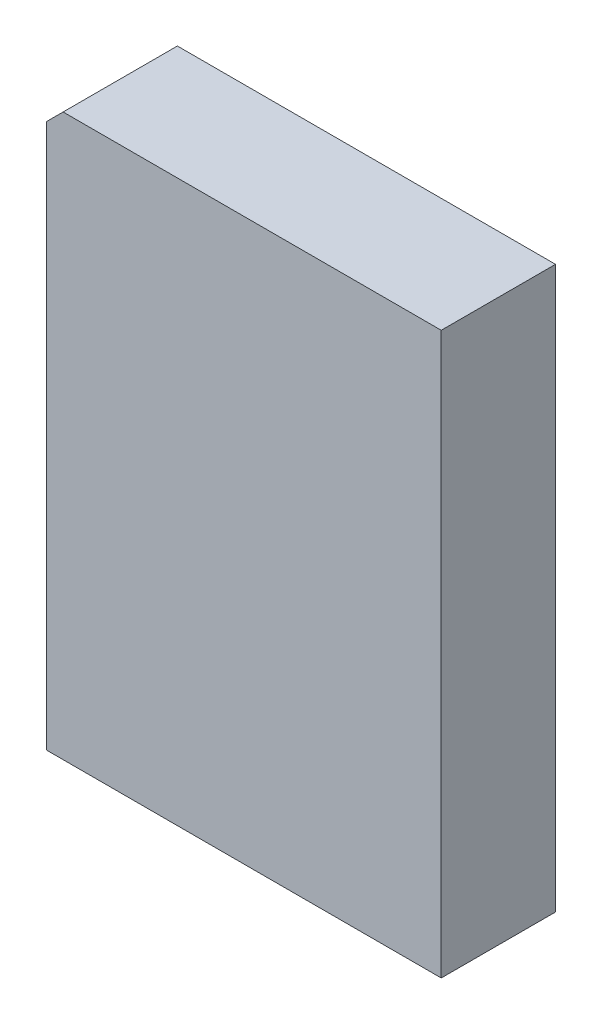
ISO-10303-21;
HEADER;
FILE_DESCRIPTION(('STEP AP214'),'2;1');
FILE_NAME('part.step','',(''),(''),'','','');
FILE_SCHEMA(('AUTOMOTIVE_DESIGN { 1 0 10303 214 1 1 1 1 }'));
ENDSEC;
DATA;
#1=APPLICATION_CONTEXT('core data for automotive mechanical design processes');
#2=APPLICATION_PROTOCOL_DEFINITION('international standard','automotive_design',2000,#1);
#3=PRODUCT_CONTEXT('',#1,'mechanical');
#4=PRODUCT('Part','Part','',(#3));
#5=PRODUCT_RELATED_PRODUCT_CATEGORY('part','',(#4));
#6=PRODUCT_DEFINITION_FORMATION('','',#4);
#7=PRODUCT_DEFINITION_CONTEXT('part definition',#1,'design');
#8=PRODUCT_DEFINITION('design','',#6,#7);
#9=PRODUCT_DEFINITION_SHAPE('','',#8);
#10=(LENGTH_UNIT() NAMED_UNIT(*) SI_UNIT(.MILLI.,.METRE.));
#11=(NAMED_UNIT(*) PLANE_ANGLE_UNIT() SI_UNIT($,.RADIAN.));
#12=(NAMED_UNIT(*) SI_UNIT($,.STERADIAN.) SOLID_ANGLE_UNIT());
#13=UNCERTAINTY_MEASURE_WITH_UNIT(LENGTH_MEASURE(1.E-05),#10,'distance_accuracy_value','');
#14=(GEOMETRIC_REPRESENTATION_CONTEXT(3) GLOBAL_UNCERTAINTY_ASSIGNED_CONTEXT((#13)) GLOBAL_UNIT_ASSIGNED_CONTEXT((#10,
#11,#12)) REPRESENTATION_CONTEXT('',''));
#15=CARTESIAN_POINT('',(0.,0.,0.));
#16=DIRECTION('',(0.,0.,1.));
#17=DIRECTION('',(1.,0.,0.));
#18=AXIS2_PLACEMENT_3D('',#15,#16,#17);
#19=CARTESIAN_POINT('',(0.95002096,-1.34999984,0.5499989));
#20=DIRECTION('',(0.,0.,-1.));
#21=DIRECTION('',(-1.,0.,0.));
#22=AXIS2_PLACEMENT_3D('',#19,#20,#21);
#23=PLANE('',#22);
#24=DIRECTION('',(0.999999999648456,2.65157964274221E-05,0.));
#25=VECTOR('',#24,1.);
#26=CARTESIAN_POINT('',(0.95002096,1.34999984,0.5499989));
#27=LINE('',#26,#25);
#28=CARTESIAN_POINT('',(0.95002096,1.34999984,0.5499989));
#29=VERTEX_POINT('',#28);
#30=CARTESIAN_POINT('',(-0.8700262,1.34995158,0.5499989));
#31=VERTEX_POINT('',#30);
#32=EDGE_CURVE('E85',#29,#31,#27,.F.);
#33=ORIENTED_EDGE('',*,*,#32,.T.);
#34=DIRECTION('',(0.707106781186048,0.707106781187048,0.));
#35=VECTOR('',#34,1.);
#36=CARTESIAN_POINT('',(-0.8700262,1.34995158,0.5499989));
#37=LINE('',#36,#35);
#38=CARTESIAN_POINT('',(-0.950018419999986,1.26995935999998,0.5499989));
#39=VERTEX_POINT('',#38);
#40=EDGE_CURVE('E61',#31,#39,#37,.F.);
#41=ORIENTED_EDGE('',*,*,#40,.T.);
#42=DIRECTION('',(-1.55116919338652E-05,0.999999999879694,0.));
#43=VECTOR('',#42,1.);
#44=CARTESIAN_POINT('',(-0.95001842,1.26995936,0.5499989));
#45=LINE('',#44,#43);
#46=CARTESIAN_POINT('',(-0.949977780000001,-1.34999984,0.5499989));
#47=VERTEX_POINT('',#46);
#48=EDGE_CURVE('E63',#39,#47,#45,.F.);
#49=ORIENTED_EDGE('',*,*,#48,.T.);
#50=DIRECTION('',(1.,0.,0.));
#51=VECTOR('',#50,1.);
#52=CARTESIAN_POINT('',(-0.94997778,-1.34999984,0.5499989));
#53=LINE('',#52,#51);
#54=CARTESIAN_POINT('',(0.95002096,-1.34999984,0.5499989));
#55=VERTEX_POINT('',#54);
#56=EDGE_CURVE('E19',#47,#55,#53,.T.);
#57=ORIENTED_EDGE('',*,*,#56,.T.);
#58=DIRECTION('',(0.,1.,0.));
#59=VECTOR('',#58,1.);
#60=CARTESIAN_POINT('',(0.95002096,-1.34999984,0.5499989));
#61=LINE('',#60,#59);
#62=EDGE_CURVE('E90',#55,#29,#61,.T.);
#63=ORIENTED_EDGE('',*,*,#62,.T.);
#64=EDGE_LOOP('',(#33,#41,#49,#57,#63));
#65=FACE_BOUND('',#64,.T.);
#66=ADVANCED_FACE('F16',(#65),#23,.F.);
#67=CARTESIAN_POINT('',(-0.94997778,-1.34999984,0.));
#68=DIRECTION('',(0.,1.,0.));
#69=DIRECTION('',(0.,0.,1.));
#70=AXIS2_PLACEMENT_3D('',#67,#68,#69);
#71=PLANE('',#70);
#72=DIRECTION('',(0.,0.,1.));
#73=VECTOR('',#72,1.);
#74=CARTESIAN_POINT('',(0.95002096,-1.34999984,0.));
#75=LINE('',#74,#73);
#76=CARTESIAN_POINT('',(0.95002096,-1.34999984,0.));
#77=VERTEX_POINT('',#76);
#78=EDGE_CURVE('E74',#77,#55,#75,.T.);
#79=ORIENTED_EDGE('',*,*,#78,.T.);
#80=ORIENTED_EDGE('',*,*,#56,.F.);
#81=DIRECTION('',(0.,0.,1.));
#82=VECTOR('',#81,1.);
#83=CARTESIAN_POINT('',(-0.949977780000005,-1.34999984,0.));
#84=LINE('',#83,#82);
#85=CARTESIAN_POINT('',(-0.949977780000001,-1.34999984,0.));
#86=VERTEX_POINT('',#85);
#87=EDGE_CURVE('E69',#47,#86,#84,.F.);
#88=ORIENTED_EDGE('',*,*,#87,.T.);
#89=DIRECTION('',(-1.,0.,0.));
#90=VECTOR('',#89,1.);
#91=CARTESIAN_POINT('',(0.95002096,-1.34999984,0.));
#92=LINE('',#91,#90);
#93=EDGE_CURVE('E93',#77,#86,#92,.T.);
#94=ORIENTED_EDGE('',*,*,#93,.F.);
#95=EDGE_LOOP('',(#79,#80,#88,#94));
#96=FACE_BOUND('',#95,.T.);
#97=ADVANCED_FACE('F71',(#96),#71,.F.);
#98=CARTESIAN_POINT('',(-0.95001842,1.26995936,0.));
#99=DIRECTION('',(0.999999999879694,1.55116919338652E-05,0.));
#100=DIRECTION('',(-1.55116919338652E-05,0.999999999879694,0.));
#101=AXIS2_PLACEMENT_3D('',#98,#99,#100);
#102=PLANE('',#101);
#103=ORIENTED_EDGE('',*,*,#87,.F.);
#104=ORIENTED_EDGE('',*,*,#48,.F.);
#105=DIRECTION('',(0.,0.,1.));
#106=VECTOR('',#105,1.);
#107=CARTESIAN_POINT('',(-0.950018419999943,1.26995935999994,0.));
#108=LINE('',#107,#106);
#109=CARTESIAN_POINT('',(-0.950018419999986,1.26995935999999,0.));
#110=VERTEX_POINT('',#109);
#111=EDGE_CURVE('E81',#39,#110,#108,.F.);
#112=ORIENTED_EDGE('',*,*,#111,.T.);
#113=DIRECTION('',(-1.55116919359411E-05,0.999999999879694,0.));
#114=VECTOR('',#113,1.);
#115=CARTESIAN_POINT('',(-0.94997778,-1.34999984,0.));
#116=LINE('',#115,#114);
#117=EDGE_CURVE('E78',#86,#110,#116,.T.);
#118=ORIENTED_EDGE('',*,*,#117,.F.);
#119=EDGE_LOOP('',(#103,#104,#112,#118));
#120=FACE_BOUND('',#119,.T.);
#121=ADVANCED_FACE('F76',(#120),#102,.F.);
#122=CARTESIAN_POINT('',(-0.8700262,1.34995158,0.));
#123=DIRECTION('',(0.707106781187048,-0.707106781186048,0.));
#124=DIRECTION('',(0.707106781186048,0.707106781187048,0.));
#125=AXIS2_PLACEMENT_3D('',#122,#123,#124);
#126=PLANE('',#125);
#127=ORIENTED_EDGE('',*,*,#111,.F.);
#128=ORIENTED_EDGE('',*,*,#40,.F.);
#129=DIRECTION('',(0.,0.,1.));
#130=VECTOR('',#129,1.);
#131=CARTESIAN_POINT('',(-0.8700262,1.34995158,0.));
#132=LINE('',#131,#130);
#133=CARTESIAN_POINT('',(-0.8700262,1.34995158,0.));
#134=VERTEX_POINT('',#133);
#135=EDGE_CURVE('E87',#31,#134,#132,.F.);
#136=ORIENTED_EDGE('',*,*,#135,.T.);
#137=DIRECTION('',(0.707106781186548,0.707106781186548,0.));
#138=VECTOR('',#137,1.);
#139=CARTESIAN_POINT('',(-0.95001842,1.26995936,0.));
#140=LINE('',#139,#138);
#141=EDGE_CURVE('E96',#110,#134,#140,.T.);
#142=ORIENTED_EDGE('',*,*,#141,.F.);
#143=EDGE_LOOP('',(#127,#128,#136,#142));
#144=FACE_BOUND('',#143,.T.);
#145=ADVANCED_FACE('F106',(#144),#126,.F.);
#146=CARTESIAN_POINT('',(0.95002096,1.34999984,0.));
#147=DIRECTION('',(2.65157964274221E-05,-0.999999999648456,0.));
#148=DIRECTION('',(0.999999999648456,2.65157964274221E-05,0.));
#149=AXIS2_PLACEMENT_3D('',#146,#147,#148);
#150=PLANE('',#149);
#151=ORIENTED_EDGE('',*,*,#135,.F.);
#152=ORIENTED_EDGE('',*,*,#32,.F.);
#153=DIRECTION('',(0.,0.,1.));
#154=VECTOR('',#153,1.);
#155=CARTESIAN_POINT('',(0.95002096,1.34999984,0.));
#156=LINE('',#155,#154);
#157=CARTESIAN_POINT('',(0.95002096,1.34999984,0.));
#158=VERTEX_POINT('',#157);
#159=EDGE_CURVE('E34',#29,#158,#156,.F.);
#160=ORIENTED_EDGE('',*,*,#159,.T.);
#161=DIRECTION('',(0.999999999648456,2.65157964275964E-05,0.));
#162=VECTOR('',#161,1.);
#163=CARTESIAN_POINT('',(-0.8700262,1.34995158,0.));
#164=LINE('',#163,#162);
#165=EDGE_CURVE('E25',#134,#158,#164,.T.);
#166=ORIENTED_EDGE('',*,*,#165,.F.);
#167=EDGE_LOOP('',(#151,#152,#160,#166));
#168=FACE_BOUND('',#167,.T.);
#169=ADVANCED_FACE('F104',(#168),#150,.F.);
#170=CARTESIAN_POINT('',(0.95002096,-1.34999984,0.));
#171=DIRECTION('',(-1.,0.,0.));
#172=DIRECTION('',(0.,0.,1.));
#173=AXIS2_PLACEMENT_3D('',#170,#171,#172);
#174=PLANE('',#173);
#175=ORIENTED_EDGE('',*,*,#159,.F.);
#176=ORIENTED_EDGE('',*,*,#62,.F.);
#177=ORIENTED_EDGE('',*,*,#78,.F.);
#178=DIRECTION('',(0.,1.,0.));
#179=VECTOR('',#178,1.);
#180=CARTESIAN_POINT('',(0.95002096,-1.34999984,0.));
#181=LINE('',#180,#179);
#182=EDGE_CURVE('E11',#158,#77,#181,.F.);
#183=ORIENTED_EDGE('',*,*,#182,.F.);
#184=EDGE_LOOP('',(#175,#176,#177,#183));
#185=FACE_BOUND('',#184,.T.);
#186=ADVANCED_FACE('F108',(#185),#174,.F.);
#187=CARTESIAN_POINT('',(0.95002096,-1.34999984,0.));
#188=DIRECTION('',(0.,0.,-1.));
#189=DIRECTION('',(-1.,0.,0.));
#190=AXIS2_PLACEMENT_3D('',#187,#188,#189);
#191=PLANE('',#190);
#192=ORIENTED_EDGE('',*,*,#165,.T.);
#193=ORIENTED_EDGE('',*,*,#182,.T.);
#194=ORIENTED_EDGE('',*,*,#93,.T.);
#195=ORIENTED_EDGE('',*,*,#117,.T.);
#196=ORIENTED_EDGE('',*,*,#141,.T.);
#197=EDGE_LOOP('',(#192,#193,#194,#195,#196));
#198=FACE_BOUND('',#197,.T.);
#199=ADVANCED_FACE('F101',(#198),#191,.T.);
#200=CLOSED_SHELL('',(#66,#97,#121,#145,#169,#186,#199));
#201=MANIFOLD_SOLID_BREP('B1',#200);
#202=ADVANCED_BREP_SHAPE_REPRESENTATION('',(#18,#201),#14);
#203=SHAPE_DEFINITION_REPRESENTATION(#9,#202);
ENDSEC;
END-ISO-10303-21;
